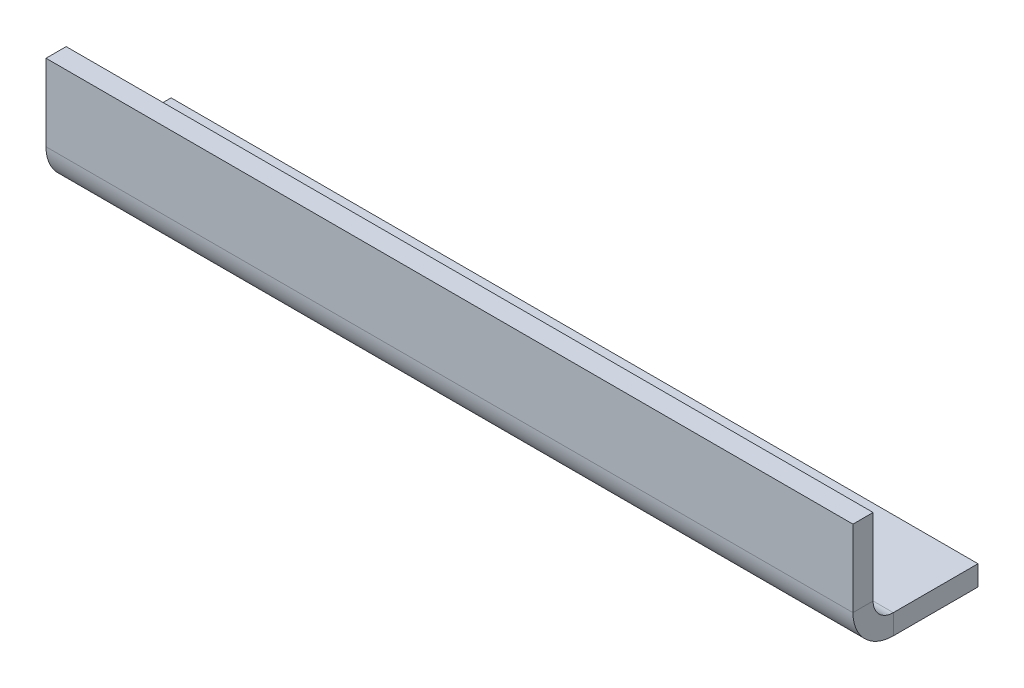
ISO-10303-21;
HEADER;
FILE_DESCRIPTION(('STEP AP214'),'2;1');
FILE_NAME('part.step','',(''),(''),'','','');
FILE_SCHEMA(('AUTOMOTIVE_DESIGN { 1 0 10303 214 1 1 1 1 }'));
ENDSEC;
DATA;
#1=APPLICATION_CONTEXT('core data for automotive mechanical design processes');
#2=APPLICATION_PROTOCOL_DEFINITION('international standard','automotive_design',2000,#1);
#3=PRODUCT_CONTEXT('',#1,'mechanical');
#4=PRODUCT('Part','Part','',(#3));
#5=PRODUCT_RELATED_PRODUCT_CATEGORY('part','',(#4));
#6=PRODUCT_DEFINITION_FORMATION('','',#4);
#7=PRODUCT_DEFINITION_CONTEXT('part definition',#1,'design');
#8=PRODUCT_DEFINITION('design','',#6,#7);
#9=PRODUCT_DEFINITION_SHAPE('','',#8);
#10=(LENGTH_UNIT() NAMED_UNIT(*) SI_UNIT(.MILLI.,.METRE.));
#11=(NAMED_UNIT(*) PLANE_ANGLE_UNIT() SI_UNIT($,.RADIAN.));
#12=(NAMED_UNIT(*) SI_UNIT($,.STERADIAN.) SOLID_ANGLE_UNIT());
#13=UNCERTAINTY_MEASURE_WITH_UNIT(LENGTH_MEASURE(1.E-05),#10,'distance_accuracy_value','');
#14=(GEOMETRIC_REPRESENTATION_CONTEXT(3) GLOBAL_UNCERTAINTY_ASSIGNED_CONTEXT((#13)) GLOBAL_UNIT_ASSIGNED_CONTEXT((#10,
#11,#12)) REPRESENTATION_CONTEXT('',''));
#15=CARTESIAN_POINT('',(0.,0.,0.));
#16=DIRECTION('',(0.,0.,1.));
#17=DIRECTION('',(1.,0.,0.));
#18=AXIS2_PLACEMENT_3D('',#15,#16,#17);
#19=CARTESIAN_POINT('',(63.5,-3.175,-7.62));
#20=DIRECTION('',(1.,0.,0.));
#21=DIRECTION('',(0.,0.,-1.));
#22=AXIS2_PLACEMENT_3D('',#19,#20,#21);
#23=PLANE('',#22);
#24=DIRECTION('',(0.,0.,-1.));
#25=VECTOR('',#24,1.);
#26=CARTESIAN_POINT('',(63.5,0.,-7.62));
#27=LINE('',#26,#25);
#28=CARTESIAN_POINT('',(63.5,0.,5.715));
#29=VERTEX_POINT('',#28);
#30=CARTESIAN_POINT('',(63.5,0.,-7.62));
#31=VERTEX_POINT('',#30);
#32=EDGE_CURVE('E106',#29,#31,#27,.T.);
#33=ORIENTED_EDGE('',*,*,#32,.F.);
#34=DIRECTION('',(0.,-1.,0.));
#35=VECTOR('',#34,1.);
#36=CARTESIAN_POINT('',(63.5,0.,5.71500000000001));
#37=LINE('',#36,#35);
#38=CARTESIAN_POINT('',(63.5,-3.17500000000001,5.71500000000001));
#39=VERTEX_POINT('',#38);
#40=EDGE_CURVE('E115',#29,#39,#37,.T.);
#41=ORIENTED_EDGE('',*,*,#40,.T.);
#42=DIRECTION('',(0.,0.,-1.));
#43=VECTOR('',#42,1.);
#44=CARTESIAN_POINT('',(63.5,-3.175,-7.62));
#45=LINE('',#44,#43);
#46=CARTESIAN_POINT('',(63.5,-3.175,-7.62));
#47=VERTEX_POINT('',#46);
#48=EDGE_CURVE('E103',#39,#47,#45,.T.);
#49=ORIENTED_EDGE('',*,*,#48,.T.);
#50=DIRECTION('',(0.,1.,0.));
#51=VECTOR('',#50,1.);
#52=CARTESIAN_POINT('',(63.5,-3.175,-7.62));
#53=LINE('',#52,#51);
#54=EDGE_CURVE('E61',#47,#31,#53,.T.);
#55=ORIENTED_EDGE('',*,*,#54,.T.);
#56=EDGE_LOOP('',(#33,#41,#49,#55));
#57=FACE_BOUND('',#56,.T.);
#58=ADVANCED_FACE('F58',(#57),#23,.T.);
#59=CARTESIAN_POINT('',(0.,-3.175,0.));
#60=DIRECTION('',(0.,1.,0.));
#61=DIRECTION('',(0.,0.,1.));
#62=AXIS2_PLACEMENT_3D('',#59,#60,#61);
#63=PLANE('',#62);
#64=DIRECTION('',(1.,0.,0.));
#65=VECTOR('',#64,1.);
#66=CARTESIAN_POINT('',(63.5,-3.17500000000001,5.71500000000001));
#67=LINE('',#66,#65);
#68=CARTESIAN_POINT('',(-63.5,-3.175,5.71500000000001));
#69=VERTEX_POINT('',#68);
#70=EDGE_CURVE('E131',#39,#69,#67,.F.);
#71=ORIENTED_EDGE('',*,*,#70,.T.);
#72=DIRECTION('',(0.,0.,1.));
#73=VECTOR('',#72,1.);
#74=CARTESIAN_POINT('',(-63.5,-3.175,-7.62));
#75=LINE('',#74,#73);
#76=CARTESIAN_POINT('',(-63.5,-3.175,-7.62));
#77=VERTEX_POINT('',#76);
#78=EDGE_CURVE('E111',#77,#69,#75,.T.);
#79=ORIENTED_EDGE('',*,*,#78,.F.);
#80=DIRECTION('',(-1.,0.,0.));
#81=VECTOR('',#80,1.);
#82=CARTESIAN_POINT('',(-63.5,-3.175,-7.62));
#83=LINE('',#82,#81);
#84=EDGE_CURVE('E96',#47,#77,#83,.T.);
#85=ORIENTED_EDGE('',*,*,#84,.F.);
#86=ORIENTED_EDGE('',*,*,#48,.F.);
#87=EDGE_LOOP('',(#71,#79,#85,#86));
#88=FACE_BOUND('',#87,.T.);
#89=ADVANCED_FACE('F209',(#88),#63,.F.);
#90=CARTESIAN_POINT('',(0.,0.,0.));
#91=DIRECTION('',(0.,1.,0.));
#92=DIRECTION('',(0.,0.,1.));
#93=AXIS2_PLACEMENT_3D('',#90,#91,#92);
#94=PLANE('',#93);
#95=DIRECTION('',(0.,0.,1.));
#96=VECTOR('',#95,1.);
#97=CARTESIAN_POINT('',(-63.5,0.,-7.62));
#98=LINE('',#97,#96);
#99=CARTESIAN_POINT('',(-63.5,0.,-7.62));
#100=VERTEX_POINT('',#99);
#101=CARTESIAN_POINT('',(-63.5,0.,5.71500000000001));
#102=VERTEX_POINT('',#101);
#103=EDGE_CURVE('E98',#100,#102,#98,.T.);
#104=ORIENTED_EDGE('',*,*,#103,.T.);
#105=DIRECTION('',(1.,0.,0.));
#106=VECTOR('',#105,1.);
#107=CARTESIAN_POINT('',(63.5,0.,5.71500000000001));
#108=LINE('',#107,#106);
#109=EDGE_CURVE('E72',#29,#102,#108,.F.);
#110=ORIENTED_EDGE('',*,*,#109,.F.);
#111=ORIENTED_EDGE('',*,*,#32,.T.);
#112=DIRECTION('',(-1.,0.,0.));
#113=VECTOR('',#112,1.);
#114=CARTESIAN_POINT('',(-63.5,0.,-7.62));
#115=LINE('',#114,#113);
#116=EDGE_CURVE('E94',#31,#100,#115,.T.);
#117=ORIENTED_EDGE('',*,*,#116,.T.);
#118=EDGE_LOOP('',(#104,#110,#111,#117));
#119=FACE_BOUND('',#118,.T.);
#120=ADVANCED_FACE('F105',(#119),#94,.T.);
#121=CARTESIAN_POINT('',(-63.5,-3.175,-7.62));
#122=DIRECTION('',(-1.,0.,0.));
#123=DIRECTION('',(0.,0.,1.));
#124=AXIS2_PLACEMENT_3D('',#121,#122,#123);
#125=PLANE('',#124);
#126=DIRECTION('',(0.,-1.,0.));
#127=VECTOR('',#126,1.);
#128=CARTESIAN_POINT('',(-63.5,0.,5.71500000000001));
#129=LINE('',#128,#127);
#130=EDGE_CURVE('E102',#102,#69,#129,.T.);
#131=ORIENTED_EDGE('',*,*,#130,.F.);
#132=ORIENTED_EDGE('',*,*,#103,.F.);
#133=DIRECTION('',(0.,1.,0.));
#134=VECTOR('',#133,1.);
#135=CARTESIAN_POINT('',(-63.5,-3.175,-7.62));
#136=LINE('',#135,#134);
#137=EDGE_CURVE('E13',#77,#100,#136,.T.);
#138=ORIENTED_EDGE('',*,*,#137,.F.);
#139=ORIENTED_EDGE('',*,*,#78,.T.);
#140=EDGE_LOOP('',(#131,#132,#138,#139));
#141=FACE_BOUND('',#140,.T.);
#142=ADVANCED_FACE('F99',(#141),#125,.T.);
#143=CARTESIAN_POINT('',(-63.5,-3.175,-7.62));
#144=DIRECTION('',(0.,0.,-1.));
#145=DIRECTION('',(-1.,0.,0.));
#146=AXIS2_PLACEMENT_3D('',#143,#144,#145);
#147=PLANE('',#146);
#148=ORIENTED_EDGE('',*,*,#116,.F.);
#149=ORIENTED_EDGE('',*,*,#54,.F.);
#150=ORIENTED_EDGE('',*,*,#84,.T.);
#151=ORIENTED_EDGE('',*,*,#137,.T.);
#152=EDGE_LOOP('',(#148,#149,#150,#151));
#153=FACE_BOUND('',#152,.T.);
#154=ADVANCED_FACE('F91',(#153),#147,.T.);
#155=CARTESIAN_POINT('',(-63.5,3.17499999999999,5.71500000000001));
#156=DIRECTION('',(-1.,0.,0.));
#157=DIRECTION('',(0.,0.,1.));
#158=AXIS2_PLACEMENT_3D('',#155,#156,#157);
#159=PLANE('',#158);
#160=DIRECTION('',(0.,0.,-1.));
#161=VECTOR('',#160,1.);
#162=CARTESIAN_POINT('',(-63.5,3.17499999999999,12.065));
#163=LINE('',#162,#161);
#164=CARTESIAN_POINT('',(-63.5,3.17499999999999,8.89000000000001));
#165=VERTEX_POINT('',#164);
#166=CARTESIAN_POINT('',(-63.5,3.17499999999999,12.065));
#167=VERTEX_POINT('',#166);
#168=EDGE_CURVE('E136',#165,#167,#163,.F.);
#169=ORIENTED_EDGE('',*,*,#168,.F.);
#170=CARTESIAN_POINT('',(-63.5,3.17499999999999,5.71500000000001));
#171=DIRECTION('',(1.,0.,0.));
#172=DIRECTION('',(0.,0.,-1.));
#173=AXIS2_PLACEMENT_3D('',#170,#171,#172);
#174=CIRCLE('',#173,3.175);
#175=EDGE_CURVE('E125',#102,#165,#174,.F.);
#176=ORIENTED_EDGE('',*,*,#175,.F.);
#177=ORIENTED_EDGE('',*,*,#130,.T.);
#178=CARTESIAN_POINT('',(-63.5,3.17499999999999,5.71500000000001));
#179=DIRECTION('',(1.,0.,0.));
#180=DIRECTION('',(0.,0.,-1.));
#181=AXIS2_PLACEMENT_3D('',#178,#179,#180);
#182=CIRCLE('',#181,6.35);
#183=EDGE_CURVE('E118',#69,#167,#182,.F.);
#184=ORIENTED_EDGE('',*,*,#183,.T.);
#185=EDGE_LOOP('',(#169,#176,#177,#184));
#186=FACE_BOUND('',#185,.T.);
#187=ADVANCED_FACE('F213',(#186),#159,.T.);
#188=CARTESIAN_POINT('',(63.5,3.17499999999999,5.71500000000001));
#189=DIRECTION('',(-1.,0.,0.));
#190=DIRECTION('',(0.,0.,1.));
#191=AXIS2_PLACEMENT_3D('',#188,#189,#190);
#192=PLANE('',#191);
#193=CARTESIAN_POINT('',(63.5,3.17499999999999,5.71500000000001));
#194=DIRECTION('',(1.,0.,0.));
#195=DIRECTION('',(0.,0.,-1.));
#196=AXIS2_PLACEMENT_3D('',#193,#194,#195);
#197=CIRCLE('',#196,3.175);
#198=CARTESIAN_POINT('',(63.5,3.17499999999999,8.89000000000001));
#199=VERTEX_POINT('',#198);
#200=EDGE_CURVE('E120',#199,#29,#197,.T.);
#201=ORIENTED_EDGE('',*,*,#200,.F.);
#202=DIRECTION('',(0.,0.,-1.));
#203=VECTOR('',#202,1.);
#204=CARTESIAN_POINT('',(63.5,3.17499999999999,8.89000000000001));
#205=LINE('',#204,#203);
#206=CARTESIAN_POINT('',(63.5,3.17499999999999,12.065));
#207=VERTEX_POINT('',#206);
#208=EDGE_CURVE('E142',#199,#207,#205,.F.);
#209=ORIENTED_EDGE('',*,*,#208,.T.);
#210=CARTESIAN_POINT('',(63.5,3.17499999999999,5.71500000000001));
#211=DIRECTION('',(1.,0.,0.));
#212=DIRECTION('',(0.,0.,-1.));
#213=AXIS2_PLACEMENT_3D('',#210,#211,#212);
#214=CIRCLE('',#213,6.35);
#215=EDGE_CURVE('E128',#207,#39,#214,.T.);
#216=ORIENTED_EDGE('',*,*,#215,.T.);
#217=ORIENTED_EDGE('',*,*,#40,.F.);
#218=EDGE_LOOP('',(#201,#209,#216,#217));
#219=FACE_BOUND('',#218,.T.);
#220=ADVANCED_FACE('F223',(#219),#192,.F.);
#221=CARTESIAN_POINT('',(63.5,3.17499999999999,5.71500000000001));
#222=DIRECTION('',(1.,0.,0.));
#223=DIRECTION('',(0.,0.,1.));
#224=AXIS2_PLACEMENT_3D('',#221,#222,#223);
#225=CYLINDRICAL_SURFACE('',#224,6.35);
#226=ORIENTED_EDGE('',*,*,#70,.F.);
#227=ORIENTED_EDGE('',*,*,#215,.F.);
#228=DIRECTION('',(1.,0.,0.));
#229=VECTOR('',#228,1.);
#230=CARTESIAN_POINT('',(-63.5,3.17499999999999,12.065));
#231=LINE('',#230,#229);
#232=EDGE_CURVE('E145',#207,#167,#231,.F.);
#233=ORIENTED_EDGE('',*,*,#232,.T.);
#234=ORIENTED_EDGE('',*,*,#183,.F.);
#235=EDGE_LOOP('',(#226,#227,#233,#234));
#236=FACE_BOUND('',#235,.T.);
#237=ADVANCED_FACE('F214',(#236),#225,.T.);
#238=CARTESIAN_POINT('',(63.5,3.17499999999999,5.71500000000001));
#239=DIRECTION('',(1.,0.,0.));
#240=DIRECTION('',(0.,0.,1.));
#241=AXIS2_PLACEMENT_3D('',#238,#239,#240);
#242=CYLINDRICAL_SURFACE('',#241,3.175);
#243=ORIENTED_EDGE('',*,*,#109,.T.);
#244=ORIENTED_EDGE('',*,*,#175,.T.);
#245=DIRECTION('',(1.,0.,0.));
#246=VECTOR('',#245,1.);
#247=CARTESIAN_POINT('',(-63.5,3.17499999999999,8.89000000000001));
#248=LINE('',#247,#246);
#249=EDGE_CURVE('E139',#165,#199,#248,.T.);
#250=ORIENTED_EDGE('',*,*,#249,.T.);
#251=ORIENTED_EDGE('',*,*,#200,.T.);
#252=EDGE_LOOP('',(#243,#244,#250,#251));
#253=FACE_BOUND('',#252,.T.);
#254=ADVANCED_FACE('F226',(#253),#242,.F.);
#255=CARTESIAN_POINT('',(63.5,15.24,12.065));
#256=DIRECTION('',(-1.,0.,0.));
#257=DIRECTION('',(0.,0.,1.));
#258=AXIS2_PLACEMENT_3D('',#255,#256,#257);
#259=PLANE('',#258);
#260=ORIENTED_EDGE('',*,*,#208,.F.);
#261=DIRECTION('',(0.,-1.,0.));
#262=VECTOR('',#261,1.);
#263=CARTESIAN_POINT('',(63.5,15.24,8.89));
#264=LINE('',#263,#262);
#265=CARTESIAN_POINT('',(63.5,15.24,8.89));
#266=VERTEX_POINT('',#265);
#267=EDGE_CURVE('E148',#199,#266,#264,.F.);
#268=ORIENTED_EDGE('',*,*,#267,.T.);
#269=DIRECTION('',(0.,0.,-1.));
#270=VECTOR('',#269,1.);
#271=CARTESIAN_POINT('',(63.5,15.24,12.065));
#272=LINE('',#271,#270);
#273=CARTESIAN_POINT('',(63.5,15.24,12.065));
#274=VERTEX_POINT('',#273);
#275=EDGE_CURVE('E123',#274,#266,#272,.T.);
#276=ORIENTED_EDGE('',*,*,#275,.F.);
#277=DIRECTION('',(0.,1.,0.));
#278=VECTOR('',#277,1.);
#279=CARTESIAN_POINT('',(63.5,0.,12.065));
#280=LINE('',#279,#278);
#281=EDGE_CURVE('E157',#207,#274,#280,.T.);
#282=ORIENTED_EDGE('',*,*,#281,.F.);
#283=EDGE_LOOP('',(#260,#268,#276,#282));
#284=FACE_BOUND('',#283,.T.);
#285=ADVANCED_FACE('F220',(#284),#259,.F.);
#286=CARTESIAN_POINT('',(-63.5,0.,12.065));
#287=DIRECTION('',(1.,0.,0.));
#288=DIRECTION('',(0.,0.,-1.));
#289=AXIS2_PLACEMENT_3D('',#286,#287,#288);
#290=PLANE('',#289);
#291=ORIENTED_EDGE('',*,*,#168,.T.);
#292=DIRECTION('',(0.,-1.,0.));
#293=VECTOR('',#292,1.);
#294=CARTESIAN_POINT('',(-63.5,0.,12.065));
#295=LINE('',#294,#293);
#296=CARTESIAN_POINT('',(-63.5,15.24,12.065));
#297=VERTEX_POINT('',#296);
#298=EDGE_CURVE('E163',#297,#167,#295,.T.);
#299=ORIENTED_EDGE('',*,*,#298,.F.);
#300=DIRECTION('',(0.,0.,-1.));
#301=VECTOR('',#300,1.);
#302=CARTESIAN_POINT('',(-63.5,15.24,12.065));
#303=LINE('',#302,#301);
#304=CARTESIAN_POINT('',(-63.5,15.24,8.89));
#305=VERTEX_POINT('',#304);
#306=EDGE_CURVE('E166',#297,#305,#303,.T.);
#307=ORIENTED_EDGE('',*,*,#306,.T.);
#308=DIRECTION('',(0.,1.,0.));
#309=VECTOR('',#308,1.);
#310=CARTESIAN_POINT('',(-63.5,0.,8.89));
#311=LINE('',#310,#309);
#312=EDGE_CURVE('E154',#305,#165,#311,.F.);
#313=ORIENTED_EDGE('',*,*,#312,.T.);
#314=EDGE_LOOP('',(#291,#299,#307,#313));
#315=FACE_BOUND('',#314,.T.);
#316=ADVANCED_FACE('F192',(#315),#290,.F.);
#317=CARTESIAN_POINT('',(0.,0.,12.065));
#318=DIRECTION('',(0.,0.,-1.));
#319=DIRECTION('',(-1.,0.,0.));
#320=AXIS2_PLACEMENT_3D('',#317,#318,#319);
#321=PLANE('',#320);
#322=ORIENTED_EDGE('',*,*,#232,.F.);
#323=ORIENTED_EDGE('',*,*,#281,.T.);
#324=DIRECTION('',(-1.,0.,0.));
#325=VECTOR('',#324,1.);
#326=CARTESIAN_POINT('',(0.,15.24,12.065));
#327=LINE('',#326,#325);
#328=EDGE_CURVE('E160',#274,#297,#327,.T.);
#329=ORIENTED_EDGE('',*,*,#328,.T.);
#330=ORIENTED_EDGE('',*,*,#298,.T.);
#331=EDGE_LOOP('',(#322,#323,#329,#330));
#332=FACE_BOUND('',#331,.T.);
#333=ADVANCED_FACE('F217',(#332),#321,.F.);
#334=CARTESIAN_POINT('',(0.,0.,8.89));
#335=DIRECTION('',(0.,0.,-1.));
#336=DIRECTION('',(-1.,0.,0.));
#337=AXIS2_PLACEMENT_3D('',#334,#335,#336);
#338=PLANE('',#337);
#339=ORIENTED_EDGE('',*,*,#267,.F.);
#340=ORIENTED_EDGE('',*,*,#249,.F.);
#341=ORIENTED_EDGE('',*,*,#312,.F.);
#342=DIRECTION('',(1.,0.,0.));
#343=VECTOR('',#342,1.);
#344=CARTESIAN_POINT('',(-63.5,15.24,8.89));
#345=LINE('',#344,#343);
#346=EDGE_CURVE('E151',#266,#305,#345,.F.);
#347=ORIENTED_EDGE('',*,*,#346,.F.);
#348=EDGE_LOOP('',(#339,#340,#341,#347));
#349=FACE_BOUND('',#348,.T.);
#350=ADVANCED_FACE('F186',(#349),#338,.T.);
#351=CARTESIAN_POINT('',(-63.5,15.24,12.065));
#352=DIRECTION('',(0.,-1.,0.));
#353=DIRECTION('',(0.,0.,-1.));
#354=AXIS2_PLACEMENT_3D('',#351,#352,#353);
#355=PLANE('',#354);
#356=ORIENTED_EDGE('',*,*,#346,.T.);
#357=ORIENTED_EDGE('',*,*,#306,.F.);
#358=ORIENTED_EDGE('',*,*,#328,.F.);
#359=ORIENTED_EDGE('',*,*,#275,.T.);
#360=EDGE_LOOP('',(#356,#357,#358,#359));
#361=FACE_BOUND('',#360,.T.);
#362=ADVANCED_FACE('F175',(#361),#355,.F.);
#363=CLOSED_SHELL('',(#58,#89,#120,#142,#154,#187,#220,#237,#254,#285,#316,#333,#350,#362));
#364=MANIFOLD_SOLID_BREP('B2',#363);
#365=ADVANCED_BREP_SHAPE_REPRESENTATION('',(#18,#364),#14);
#366=SHAPE_DEFINITION_REPRESENTATION(#9,#365);
ENDSEC;
END-ISO-10303-21;
